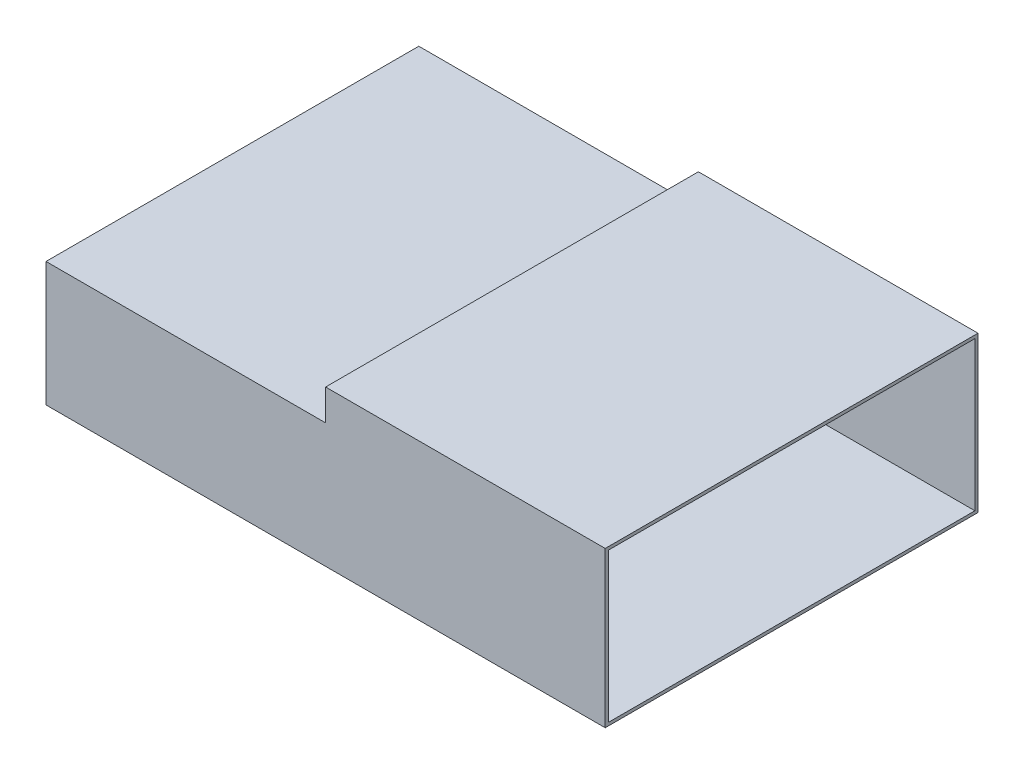
ISO-10303-21;
HEADER;
FILE_DESCRIPTION(('STEP AP214'),'2;1');
FILE_NAME('part.step','',(''),(''),'','','');
FILE_SCHEMA(('AUTOMOTIVE_DESIGN { 1 0 10303 214 1 1 1 1 }'));
ENDSEC;
DATA;
#1=APPLICATION_CONTEXT('core data for automotive mechanical design processes');
#2=APPLICATION_PROTOCOL_DEFINITION('international standard','automotive_design',2000,#1);
#3=PRODUCT_CONTEXT('',#1,'mechanical');
#4=PRODUCT('Part','Part','',(#3));
#5=PRODUCT_RELATED_PRODUCT_CATEGORY('part','',(#4));
#6=PRODUCT_DEFINITION_FORMATION('','',#4);
#7=PRODUCT_DEFINITION_CONTEXT('part definition',#1,'design');
#8=PRODUCT_DEFINITION('design','',#6,#7);
#9=PRODUCT_DEFINITION_SHAPE('','',#8);
#10=(LENGTH_UNIT() NAMED_UNIT(*) SI_UNIT(.MILLI.,.METRE.));
#11=(NAMED_UNIT(*) PLANE_ANGLE_UNIT() SI_UNIT($,.RADIAN.));
#12=(NAMED_UNIT(*) SI_UNIT($,.STERADIAN.) SOLID_ANGLE_UNIT());
#13=UNCERTAINTY_MEASURE_WITH_UNIT(LENGTH_MEASURE(1.E-05),#10,'distance_accuracy_value','');
#14=(GEOMETRIC_REPRESENTATION_CONTEXT(3) GLOBAL_UNCERTAINTY_ASSIGNED_CONTEXT((#13)) GLOBAL_UNIT_ASSIGNED_CONTEXT((#10,
#11,#12)) REPRESENTATION_CONTEXT('',''));
#15=CARTESIAN_POINT('',(0.,0.,0.));
#16=DIRECTION('',(0.,0.,1.));
#17=DIRECTION('',(1.,0.,0.));
#18=AXIS2_PLACEMENT_3D('',#15,#16,#17);
#19=CARTESIAN_POINT('',(-38.7398119122257,25.,27.9122257053291));
#20=DIRECTION('',(0.,0.,-1.));
#21=DIRECTION('',(-1.,0.,0.));
#22=AXIS2_PLACEMENT_3D('',#19,#20,#21);
#23=PLANE('',#22);
#24=DIRECTION('',(0.,1.,0.));
#25=VECTOR('',#24,1.);
#26=CARTESIAN_POINT('',(6.26018808777427,20.,27.9122257053291));
#27=LINE('',#26,#25);
#28=CARTESIAN_POINT('',(6.26018808777427,20.,27.9122257053291));
#29=VERTEX_POINT('',#28);
#30=CARTESIAN_POINT('',(6.26018808777425,25.,27.9122257053291));
#31=VERTEX_POINT('',#30);
#32=EDGE_CURVE('E196',#29,#31,#27,.T.);
#33=ORIENTED_EDGE('',*,*,#32,.F.);
#34=DIRECTION('',(-1.,0.,0.));
#35=VECTOR('',#34,1.);
#36=CARTESIAN_POINT('',(0.,20.,27.9122257053291));
#37=LINE('',#36,#35);
#38=CARTESIAN_POINT('',(-38.7398119122257,20.,27.9122257053291));
#39=VERTEX_POINT('',#38);
#40=EDGE_CURVE('E182',#29,#39,#37,.T.);
#41=ORIENTED_EDGE('',*,*,#40,.T.);
#42=DIRECTION('',(0.,-1.,0.));
#43=VECTOR('',#42,1.);
#44=CARTESIAN_POINT('',(-38.7398119122257,25.,27.9122257053291));
#45=LINE('',#44,#43);
#46=CARTESIAN_POINT('',(-38.7398119122257,0.,27.9122257053291));
#47=VERTEX_POINT('',#46);
#48=EDGE_CURVE('E11',#39,#47,#45,.T.);
#49=ORIENTED_EDGE('',*,*,#48,.T.);
#50=DIRECTION('',(1.,0.,0.));
#51=VECTOR('',#50,1.);
#52=CARTESIAN_POINT('',(-38.7398119122257,0.,27.9122257053291));
#53=LINE('',#52,#51);
#54=CARTESIAN_POINT('',(51.2601880877743,0.,27.9122257053291));
#55=VERTEX_POINT('',#54);
#56=EDGE_CURVE('E210',#47,#55,#53,.T.);
#57=ORIENTED_EDGE('',*,*,#56,.T.);
#58=DIRECTION('',(0.,-1.,0.));
#59=VECTOR('',#58,1.);
#60=CARTESIAN_POINT('',(51.2601880877743,25.,27.9122257053291));
#61=LINE('',#60,#59);
#62=CARTESIAN_POINT('',(51.2601880877743,25.,27.9122257053291));
#63=VERTEX_POINT('',#62);
#64=EDGE_CURVE('E44',#63,#55,#61,.T.);
#65=ORIENTED_EDGE('',*,*,#64,.F.);
#66=DIRECTION('',(1.,0.,0.));
#67=VECTOR('',#66,1.);
#68=CARTESIAN_POINT('',(-38.7398119122257,25.,27.9122257053291));
#69=LINE('',#68,#67);
#70=EDGE_CURVE('E199',#31,#63,#69,.T.);
#71=ORIENTED_EDGE('',*,*,#70,.F.);
#72=EDGE_LOOP('',(#33,#41,#49,#57,#65,#71));
#73=FACE_BOUND('',#72,.T.);
#74=ADVANCED_FACE('F36',(#73),#23,.F.);
#75=CARTESIAN_POINT('',(-38.7398119122257,25.,-32.0877742946709));
#76=DIRECTION('',(0.,0.,1.));
#77=DIRECTION('',(1.,0.,0.));
#78=AXIS2_PLACEMENT_3D('',#75,#76,#77);
#79=PLANE('',#78);
#80=DIRECTION('',(0.,1.,0.));
#81=VECTOR('',#80,1.);
#82=CARTESIAN_POINT('',(6.26018808777427,20.,-32.0877742946709));
#83=LINE('',#82,#81);
#84=CARTESIAN_POINT('',(6.26018808777427,20.,-32.0877742946709));
#85=VERTEX_POINT('',#84);
#86=CARTESIAN_POINT('',(6.26018808777427,25.,-32.0877742946709));
#87=VERTEX_POINT('',#86);
#88=EDGE_CURVE('E191',#85,#87,#83,.T.);
#89=ORIENTED_EDGE('',*,*,#88,.T.);
#90=DIRECTION('',(-1.,0.,0.));
#91=VECTOR('',#90,1.);
#92=CARTESIAN_POINT('',(-38.7398119122257,25.,-32.0877742946709));
#93=LINE('',#92,#91);
#94=CARTESIAN_POINT('',(51.2601880877743,25.,-32.0877742946709));
#95=VERTEX_POINT('',#94);
#96=EDGE_CURVE('E204',#95,#87,#93,.T.);
#97=ORIENTED_EDGE('',*,*,#96,.F.);
#98=DIRECTION('',(0.,-1.,0.));
#99=VECTOR('',#98,1.);
#100=CARTESIAN_POINT('',(51.2601880877743,25.,-32.0877742946709));
#101=LINE('',#100,#99);
#102=CARTESIAN_POINT('',(51.2601880877743,0.,-32.0877742946709));
#103=VERTEX_POINT('',#102);
#104=EDGE_CURVE('E217',#95,#103,#101,.T.);
#105=ORIENTED_EDGE('',*,*,#104,.T.);
#106=DIRECTION('',(-1.,0.,0.));
#107=VECTOR('',#106,1.);
#108=CARTESIAN_POINT('',(-38.7398119122257,0.,-32.0877742946709));
#109=LINE('',#108,#107);
#110=CARTESIAN_POINT('',(-38.7398119122257,0.,-32.0877742946709));
#111=VERTEX_POINT('',#110);
#112=EDGE_CURVE('E202',#103,#111,#109,.T.);
#113=ORIENTED_EDGE('',*,*,#112,.T.);
#114=DIRECTION('',(0.,-1.,0.));
#115=VECTOR('',#114,1.);
#116=CARTESIAN_POINT('',(-38.7398119122257,25.,-32.0877742946709));
#117=LINE('',#116,#115);
#118=CARTESIAN_POINT('',(-38.7398119122257,20.,-32.0877742946709));
#119=VERTEX_POINT('',#118);
#120=EDGE_CURVE('E207',#119,#111,#117,.T.);
#121=ORIENTED_EDGE('',*,*,#120,.F.);
#122=DIRECTION('',(1.,0.,0.));
#123=VECTOR('',#122,1.);
#124=CARTESIAN_POINT('',(0.,20.,-32.0877742946709));
#125=LINE('',#124,#123);
#126=EDGE_CURVE('E188',#119,#85,#125,.T.);
#127=ORIENTED_EDGE('',*,*,#126,.T.);
#128=EDGE_LOOP('',(#89,#97,#105,#113,#121,#127));
#129=FACE_BOUND('',#128,.T.);
#130=ADVANCED_FACE('F235',(#129),#79,.F.);
#131=CARTESIAN_POINT('',(0.,25.,0.));
#132=DIRECTION('',(0.,1.,0.));
#133=DIRECTION('',(0.,0.,1.));
#134=AXIS2_PLACEMENT_3D('',#131,#132,#133);
#135=PLANE('',#134);
#136=ORIENTED_EDGE('',*,*,#96,.T.);
#137=DIRECTION('',(0.,0.,1.));
#138=VECTOR('',#137,1.);
#139=CARTESIAN_POINT('',(6.26018808777427,25.,0.));
#140=LINE('',#139,#138);
#141=EDGE_CURVE('E176',#87,#31,#140,.T.);
#142=ORIENTED_EDGE('',*,*,#141,.T.);
#143=ORIENTED_EDGE('',*,*,#70,.T.);
#144=DIRECTION('',(0.,0.,-1.));
#145=VECTOR('',#144,1.);
#146=CARTESIAN_POINT('',(51.2601880877743,25.,-32.0877742946709));
#147=LINE('',#146,#145);
#148=EDGE_CURVE('E201',#63,#95,#147,.T.);
#149=ORIENTED_EDGE('',*,*,#148,.T.);
#150=EDGE_LOOP('',(#136,#142,#143,#149));
#151=FACE_BOUND('',#150,.T.);
#152=ADVANCED_FACE('F238',(#151),#135,.T.);
#153=CARTESIAN_POINT('',(-38.7398119122257,25.,-32.0877742946709));
#154=DIRECTION('',(1.,0.,0.));
#155=DIRECTION('',(0.,0.,-1.));
#156=AXIS2_PLACEMENT_3D('',#153,#154,#155);
#157=PLANE('',#156);
#158=ORIENTED_EDGE('',*,*,#48,.F.);
#159=DIRECTION('',(0.,0.,-1.));
#160=VECTOR('',#159,1.);
#161=CARTESIAN_POINT('',(-38.7398119122257,20.,0.));
#162=LINE('',#161,#160);
#163=EDGE_CURVE('E185',#39,#119,#162,.T.);
#164=ORIENTED_EDGE('',*,*,#163,.T.);
#165=ORIENTED_EDGE('',*,*,#120,.T.);
#166=DIRECTION('',(0.,0.,1.));
#167=VECTOR('',#166,1.);
#168=CARTESIAN_POINT('',(-38.7398119122257,0.,-32.0877742946709));
#169=LINE('',#168,#167);
#170=EDGE_CURVE('E198',#111,#47,#169,.T.);
#171=ORIENTED_EDGE('',*,*,#170,.T.);
#172=EDGE_LOOP('',(#158,#164,#165,#171));
#173=FACE_BOUND('',#172,.T.);
#174=ADVANCED_FACE('F38',(#173),#157,.F.);
#175=CARTESIAN_POINT('',(51.2601880877743,25.,-32.0877742946709));
#176=DIRECTION('',(-1.,0.,0.));
#177=DIRECTION('',(0.,0.,1.));
#178=AXIS2_PLACEMENT_3D('',#175,#176,#177);
#179=PLANE('',#178);
#180=DIRECTION('',(0.,0.,-1.));
#181=VECTOR('',#180,1.);
#182=CARTESIAN_POINT('',(51.2601880877743,0.5,27.4122257053291));
#183=LINE('',#182,#181);
#184=CARTESIAN_POINT('',(51.2601880877743,0.5,27.4122257053291));
#185=VERTEX_POINT('',#184);
#186=CARTESIAN_POINT('',(51.2601880877743,0.5,-31.5877742946709));
#187=VERTEX_POINT('',#186);
#188=EDGE_CURVE('E132',#185,#187,#183,.T.);
#189=ORIENTED_EDGE('',*,*,#188,.F.);
#190=DIRECTION('',(0.,-1.,0.));
#191=VECTOR('',#190,1.);
#192=CARTESIAN_POINT('',(51.2601880877743,24.5,27.4122257053291));
#193=LINE('',#192,#191);
#194=CARTESIAN_POINT('',(51.2601880877743,24.5,27.4122257053291));
#195=VERTEX_POINT('',#194);
#196=EDGE_CURVE('E59',#195,#185,#193,.T.);
#197=ORIENTED_EDGE('',*,*,#196,.F.);
#198=DIRECTION('',(0.,0.,1.));
#199=VECTOR('',#198,1.);
#200=CARTESIAN_POINT('',(51.2601880877743,24.5,27.4122257053291));
#201=LINE('',#200,#199);
#202=CARTESIAN_POINT('',(51.2601880877743,24.5,-31.5877742946709));
#203=VERTEX_POINT('',#202);
#204=EDGE_CURVE('E163',#203,#195,#201,.T.);
#205=ORIENTED_EDGE('',*,*,#204,.F.);
#206=DIRECTION('',(0.,1.,0.));
#207=VECTOR('',#206,1.);
#208=CARTESIAN_POINT('',(51.2601880877743,24.5,-31.5877742946709));
#209=LINE('',#208,#207);
#210=EDGE_CURVE('E170',#187,#203,#209,.T.);
#211=ORIENTED_EDGE('',*,*,#210,.F.);
#212=EDGE_LOOP('',(#189,#197,#205,#211));
#213=FACE_BOUND('',#212,.T.);
#214=DIRECTION('',(0.,0.,-1.));
#215=VECTOR('',#214,1.);
#216=CARTESIAN_POINT('',(51.2601880877743,0.,-32.0877742946709));
#217=LINE('',#216,#215);
#218=EDGE_CURVE('E212',#55,#103,#217,.T.);
#219=ORIENTED_EDGE('',*,*,#218,.T.);
#220=ORIENTED_EDGE('',*,*,#104,.F.);
#221=ORIENTED_EDGE('',*,*,#148,.F.);
#222=ORIENTED_EDGE('',*,*,#64,.T.);
#223=EDGE_LOOP('',(#219,#220,#221,#222));
#224=FACE_BOUND('',#223,.T.);
#225=ADVANCED_FACE('F224',(#213,#224),#179,.F.);
#226=CARTESIAN_POINT('',(0.,0.,0.));
#227=DIRECTION('',(0.,1.,0.));
#228=DIRECTION('',(0.,0.,1.));
#229=AXIS2_PLACEMENT_3D('',#226,#227,#228);
#230=PLANE('',#229);
#231=ORIENTED_EDGE('',*,*,#170,.F.);
#232=ORIENTED_EDGE('',*,*,#112,.F.);
#233=ORIENTED_EDGE('',*,*,#218,.F.);
#234=ORIENTED_EDGE('',*,*,#56,.F.);
#235=EDGE_LOOP('',(#231,#232,#233,#234));
#236=FACE_BOUND('',#235,.T.);
#237=ADVANCED_FACE('F232',(#236),#230,.F.);
#238=CARTESIAN_POINT('',(6.26018808777427,20.,0.));
#239=DIRECTION('',(-1.,0.,0.));
#240=DIRECTION('',(0.,0.,1.));
#241=AXIS2_PLACEMENT_3D('',#238,#239,#240);
#242=PLANE('',#241);
#243=ORIENTED_EDGE('',*,*,#141,.F.);
#244=ORIENTED_EDGE('',*,*,#88,.F.);
#245=DIRECTION('',(0.,0.,1.));
#246=VECTOR('',#245,1.);
#247=CARTESIAN_POINT('',(6.26018808777427,20.,0.));
#248=LINE('',#247,#246);
#249=EDGE_CURVE('E179',#85,#29,#248,.T.);
#250=ORIENTED_EDGE('',*,*,#249,.T.);
#251=ORIENTED_EDGE('',*,*,#32,.T.);
#252=EDGE_LOOP('',(#243,#244,#250,#251));
#253=FACE_BOUND('',#252,.T.);
#254=ADVANCED_FACE('F242',(#253),#242,.T.);
#255=CARTESIAN_POINT('',(0.,20.,0.));
#256=DIRECTION('',(0.,-1.,0.));
#257=DIRECTION('',(0.,0.,-1.));
#258=AXIS2_PLACEMENT_3D('',#255,#256,#257);
#259=PLANE('',#258);
#260=ORIENTED_EDGE('',*,*,#249,.F.);
#261=ORIENTED_EDGE('',*,*,#126,.F.);
#262=ORIENTED_EDGE('',*,*,#163,.F.);
#263=ORIENTED_EDGE('',*,*,#40,.F.);
#264=EDGE_LOOP('',(#260,#261,#262,#263));
#265=FACE_BOUND('',#264,.T.);
#266=ADVANCED_FACE('F245',(#265),#259,.F.);
#267=CARTESIAN_POINT('',(6.76018808777427,24.5,27.4122257053291));
#268=DIRECTION('',(0.,0.,1.));
#269=DIRECTION('',(0.,-1.,0.));
#270=AXIS2_PLACEMENT_3D('',#267,#268,#269);
#271=PLANE('',#270);
#272=ORIENTED_EDGE('',*,*,#196,.T.);
#273=DIRECTION('',(1.,0.,0.));
#274=VECTOR('',#273,1.);
#275=CARTESIAN_POINT('',(6.76018808777427,0.5,27.4122257053291));
#276=LINE('',#275,#274);
#277=CARTESIAN_POINT('',(-38.2398119122257,0.5,27.4122257053291));
#278=VERTEX_POINT('',#277);
#279=EDGE_CURVE('E137',#278,#185,#276,.T.);
#280=ORIENTED_EDGE('',*,*,#279,.F.);
#281=DIRECTION('',(0.,-1.,0.));
#282=VECTOR('',#281,1.);
#283=CARTESIAN_POINT('',(-38.2398119122257,0.,27.4122257053291));
#284=LINE('',#283,#282);
#285=CARTESIAN_POINT('',(-38.2398119122257,19.5,27.4122257053291));
#286=VERTEX_POINT('',#285);
#287=EDGE_CURVE('E149',#286,#278,#284,.T.);
#288=ORIENTED_EDGE('',*,*,#287,.F.);
#289=DIRECTION('',(1.,0.,0.));
#290=VECTOR('',#289,1.);
#291=CARTESIAN_POINT('',(-38.2398119122257,19.5,27.4122257053291));
#292=LINE('',#291,#290);
#293=CARTESIAN_POINT('',(6.76018808777427,19.5,27.4122257053291));
#294=VERTEX_POINT('',#293);
#295=EDGE_CURVE('E156',#286,#294,#292,.T.);
#296=ORIENTED_EDGE('',*,*,#295,.T.);
#297=DIRECTION('',(0.,-1.,0.));
#298=VECTOR('',#297,1.);
#299=CARTESIAN_POINT('',(6.76018808777427,24.5,27.4122257053291));
#300=LINE('',#299,#298);
#301=CARTESIAN_POINT('',(6.76018808777427,24.5,27.4122257053291));
#302=VERTEX_POINT('',#301);
#303=EDGE_CURVE('E159',#302,#294,#300,.T.);
#304=ORIENTED_EDGE('',*,*,#303,.F.);
#305=DIRECTION('',(1.,0.,0.));
#306=VECTOR('',#305,1.);
#307=CARTESIAN_POINT('',(6.76018808777427,24.5,27.4122257053291));
#308=LINE('',#307,#306);
#309=EDGE_CURVE('E174',#302,#195,#308,.T.);
#310=ORIENTED_EDGE('',*,*,#309,.T.);
#311=EDGE_LOOP('',(#272,#280,#288,#296,#304,#310));
#312=FACE_BOUND('',#311,.T.);
#313=ADVANCED_FACE('F267',(#312),#271,.F.);
#314=CARTESIAN_POINT('',(6.76018808777427,24.5,27.4122257053291));
#315=DIRECTION('',(0.,1.,0.));
#316=DIRECTION('',(0.,0.,1.));
#317=AXIS2_PLACEMENT_3D('',#314,#315,#316);
#318=PLANE('',#317);
#319=ORIENTED_EDGE('',*,*,#204,.T.);
#320=ORIENTED_EDGE('',*,*,#309,.F.);
#321=DIRECTION('',(0.,0.,1.));
#322=VECTOR('',#321,1.);
#323=CARTESIAN_POINT('',(6.76018808777427,24.5,27.4122257053291));
#324=LINE('',#323,#322);
#325=CARTESIAN_POINT('',(6.76018808777427,24.5,-31.5877742946709));
#326=VERTEX_POINT('',#325);
#327=EDGE_CURVE('E165',#326,#302,#324,.T.);
#328=ORIENTED_EDGE('',*,*,#327,.F.);
#329=DIRECTION('',(1.,0.,0.));
#330=VECTOR('',#329,1.);
#331=CARTESIAN_POINT('',(6.76018808777427,24.5,-31.5877742946709));
#332=LINE('',#331,#330);
#333=EDGE_CURVE('E136',#326,#203,#332,.T.);
#334=ORIENTED_EDGE('',*,*,#333,.T.);
#335=EDGE_LOOP('',(#319,#320,#328,#334));
#336=FACE_BOUND('',#335,.T.);
#337=ADVANCED_FACE('F270',(#336),#318,.F.);
#338=CARTESIAN_POINT('',(6.76018808777427,24.5,-31.5877742946709));
#339=DIRECTION('',(0.,0.,-1.));
#340=DIRECTION('',(0.,1.,0.));
#341=AXIS2_PLACEMENT_3D('',#338,#339,#340);
#342=PLANE('',#341);
#343=ORIENTED_EDGE('',*,*,#210,.T.);
#344=ORIENTED_EDGE('',*,*,#333,.F.);
#345=DIRECTION('',(0.,1.,0.));
#346=VECTOR('',#345,1.);
#347=CARTESIAN_POINT('',(6.76018808777427,24.5,-31.5877742946709));
#348=LINE('',#347,#346);
#349=CARTESIAN_POINT('',(6.76018808777427,19.5,-31.5877742946709));
#350=VERTEX_POINT('',#349);
#351=EDGE_CURVE('E162',#350,#326,#348,.T.);
#352=ORIENTED_EDGE('',*,*,#351,.F.);
#353=DIRECTION('',(1.,0.,0.));
#354=VECTOR('',#353,1.);
#355=CARTESIAN_POINT('',(-38.2398119122257,19.5,-31.5877742946709));
#356=LINE('',#355,#354);
#357=CARTESIAN_POINT('',(-38.2398119122257,19.5,-31.5877742946709));
#358=VERTEX_POINT('',#357);
#359=EDGE_CURVE('E51',#358,#350,#356,.T.);
#360=ORIENTED_EDGE('',*,*,#359,.F.);
#361=DIRECTION('',(0.,1.,0.));
#362=VECTOR('',#361,1.);
#363=CARTESIAN_POINT('',(-38.2398119122257,0.,-31.5877742946708));
#364=LINE('',#363,#362);
#365=CARTESIAN_POINT('',(-38.2398119122257,0.5,-31.5877742946708));
#366=VERTEX_POINT('',#365);
#367=EDGE_CURVE('E140',#366,#358,#364,.T.);
#368=ORIENTED_EDGE('',*,*,#367,.F.);
#369=DIRECTION('',(1.,0.,0.));
#370=VECTOR('',#369,1.);
#371=CARTESIAN_POINT('',(6.76018808777427,0.5,-31.5877742946709));
#372=LINE('',#371,#370);
#373=EDGE_CURVE('E125',#366,#187,#372,.T.);
#374=ORIENTED_EDGE('',*,*,#373,.T.);
#375=EDGE_LOOP('',(#343,#344,#352,#360,#368,#374));
#376=FACE_BOUND('',#375,.T.);
#377=ADVANCED_FACE('F141',(#376),#342,.F.);
#378=CARTESIAN_POINT('',(6.76018808777427,0.5,27.4122257053291));
#379=DIRECTION('',(0.,-1.,0.));
#380=DIRECTION('',(0.,0.,-1.));
#381=AXIS2_PLACEMENT_3D('',#378,#379,#380);
#382=PLANE('',#381);
#383=ORIENTED_EDGE('',*,*,#188,.T.);
#384=ORIENTED_EDGE('',*,*,#373,.F.);
#385=DIRECTION('',(0.,0.,-1.));
#386=VECTOR('',#385,1.);
#387=CARTESIAN_POINT('',(-38.2398119122257,0.5,0.));
#388=LINE('',#387,#386);
#389=EDGE_CURVE('E129',#278,#366,#388,.T.);
#390=ORIENTED_EDGE('',*,*,#389,.F.);
#391=ORIENTED_EDGE('',*,*,#279,.T.);
#392=EDGE_LOOP('',(#383,#384,#390,#391));
#393=FACE_BOUND('',#392,.T.);
#394=ADVANCED_FACE('F127',(#393),#382,.F.);
#395=CARTESIAN_POINT('',(6.76018808777427,0.,0.));
#396=DIRECTION('',(1.,0.,0.));
#397=DIRECTION('',(0.,0.,-1.));
#398=AXIS2_PLACEMENT_3D('',#395,#396,#397);
#399=PLANE('',#398);
#400=DIRECTION('',(0.,0.,1.));
#401=VECTOR('',#400,1.);
#402=CARTESIAN_POINT('',(6.76018808777427,19.5,0.));
#403=LINE('',#402,#401);
#404=EDGE_CURVE('E150',#350,#294,#403,.T.);
#405=ORIENTED_EDGE('',*,*,#404,.F.);
#406=ORIENTED_EDGE('',*,*,#351,.T.);
#407=ORIENTED_EDGE('',*,*,#327,.T.);
#408=ORIENTED_EDGE('',*,*,#303,.T.);
#409=EDGE_LOOP('',(#405,#406,#407,#408));
#410=FACE_BOUND('',#409,.T.);
#411=ADVANCED_FACE('F273',(#410),#399,.T.);
#412=CARTESIAN_POINT('',(-38.2398119122257,19.5,0.));
#413=DIRECTION('',(0.,1.,0.));
#414=DIRECTION('',(0.,0.,1.));
#415=AXIS2_PLACEMENT_3D('',#412,#413,#414);
#416=PLANE('',#415);
#417=ORIENTED_EDGE('',*,*,#404,.T.);
#418=ORIENTED_EDGE('',*,*,#295,.F.);
#419=DIRECTION('',(0.,0.,1.));
#420=VECTOR('',#419,1.);
#421=CARTESIAN_POINT('',(-38.2398119122257,19.5,0.));
#422=LINE('',#421,#420);
#423=EDGE_CURVE('E145',#358,#286,#422,.T.);
#424=ORIENTED_EDGE('',*,*,#423,.F.);
#425=ORIENTED_EDGE('',*,*,#359,.T.);
#426=EDGE_LOOP('',(#417,#418,#424,#425));
#427=FACE_BOUND('',#426,.T.);
#428=ADVANCED_FACE('F281',(#427),#416,.F.);
#429=CARTESIAN_POINT('',(-38.2398119122257,0.,0.));
#430=DIRECTION('',(1.,0.,0.));
#431=DIRECTION('',(0.,0.,-1.));
#432=AXIS2_PLACEMENT_3D('',#429,#430,#431);
#433=PLANE('',#432);
#434=ORIENTED_EDGE('',*,*,#389,.T.);
#435=ORIENTED_EDGE('',*,*,#367,.T.);
#436=ORIENTED_EDGE('',*,*,#423,.T.);
#437=ORIENTED_EDGE('',*,*,#287,.T.);
#438=EDGE_LOOP('',(#434,#435,#436,#437));
#439=FACE_BOUND('',#438,.T.);
#440=ADVANCED_FACE('F147',(#439),#433,.T.);
#441=CLOSED_SHELL('',(#74,#130,#152,#174,#225,#237,#254,#266,#313,#337,#377,#394,#411,#428,#440));
#442=MANIFOLD_SOLID_BREP('B2',#441);
#443=ADVANCED_BREP_SHAPE_REPRESENTATION('',(#18,#442),#14);
#444=SHAPE_DEFINITION_REPRESENTATION(#9,#443);
ENDSEC;
END-ISO-10303-21;
